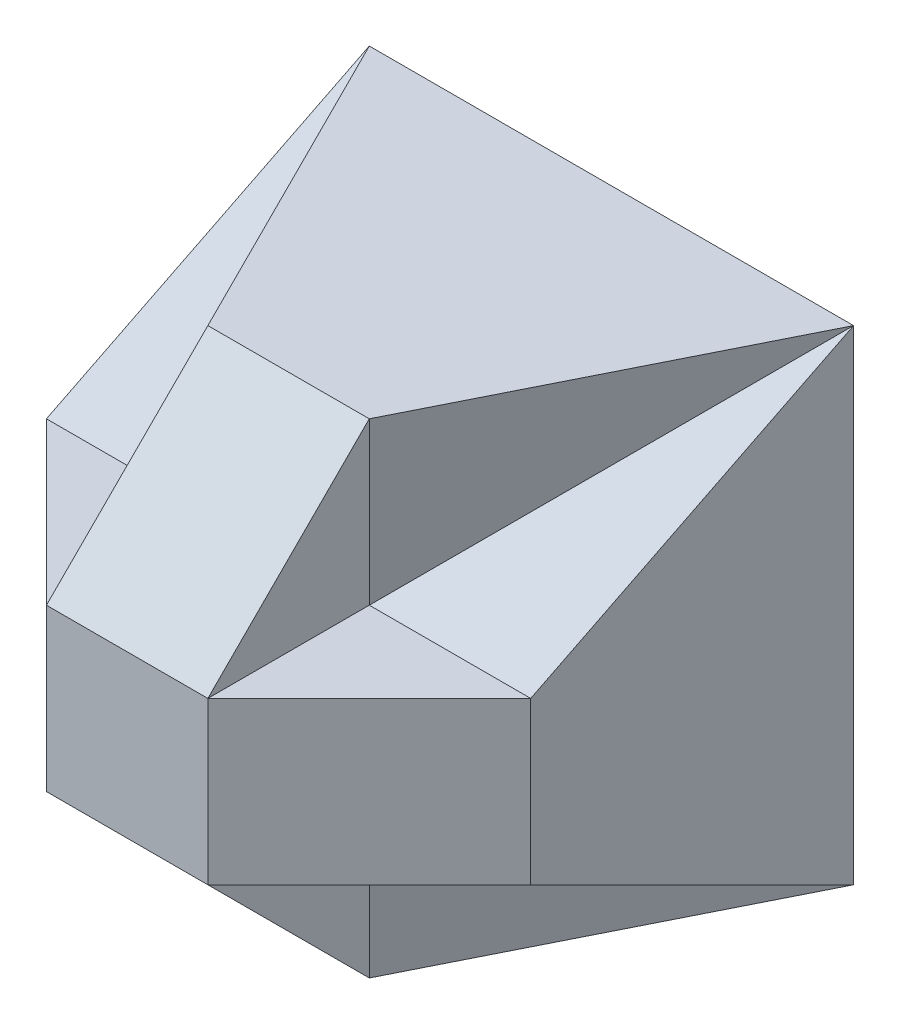
ISO-10303-21;
HEADER;
FILE_DESCRIPTION(('STEP AP214'),'2;1');
FILE_NAME('part.step','',(''),(''),'','','');
FILE_SCHEMA(('AUTOMOTIVE_DESIGN { 1 0 10303 214 1 1 1 1 }'));
ENDSEC;
DATA;
#1=APPLICATION_CONTEXT('core data for automotive mechanical design processes');
#2=APPLICATION_PROTOCOL_DEFINITION('international standard','automotive_design',2000,#1);
#3=PRODUCT_CONTEXT('',#1,'mechanical');
#4=PRODUCT('Part','Part','',(#3));
#5=PRODUCT_RELATED_PRODUCT_CATEGORY('part','',(#4));
#6=PRODUCT_DEFINITION_FORMATION('','',#4);
#7=PRODUCT_DEFINITION_CONTEXT('part definition',#1,'design');
#8=PRODUCT_DEFINITION('design','',#6,#7);
#9=PRODUCT_DEFINITION_SHAPE('','',#8);
#10=(LENGTH_UNIT() NAMED_UNIT(*) SI_UNIT(.MILLI.,.METRE.));
#11=(NAMED_UNIT(*) PLANE_ANGLE_UNIT() SI_UNIT($,.RADIAN.));
#12=(NAMED_UNIT(*) SI_UNIT($,.STERADIAN.) SOLID_ANGLE_UNIT());
#13=UNCERTAINTY_MEASURE_WITH_UNIT(LENGTH_MEASURE(1.E-05),#10,'distance_accuracy_value','');
#14=(GEOMETRIC_REPRESENTATION_CONTEXT(3) GLOBAL_UNCERTAINTY_ASSIGNED_CONTEXT((#13)) GLOBAL_UNIT_ASSIGNED_CONTEXT((#10,
#11,#12)) REPRESENTATION_CONTEXT('',''));
#15=CARTESIAN_POINT('',(0.,0.,0.));
#16=DIRECTION('',(0.,0.,1.));
#17=DIRECTION('',(1.,0.,0.));
#18=AXIS2_PLACEMENT_3D('',#15,#16,#17);
#19=CARTESIAN_POINT('',(-1.5,1.5,6.));
#20=DIRECTION('',(0.,-1.,0.));
#21=DIRECTION('',(0.,0.,-1.));
#22=AXIS2_PLACEMENT_3D('',#19,#20,#21);
#23=PLANE('',#22);
#24=DIRECTION('',(0.,0.,-1.));
#25=VECTOR('',#24,1.);
#26=CARTESIAN_POINT('',(-1.49999999999998,1.50000000000002,3.));
#27=LINE('',#26,#25);
#28=CARTESIAN_POINT('',(-1.49999999999998,1.50000000000002,6.));
#29=VERTEX_POINT('',#28);
#30=CARTESIAN_POINT('',(-1.49999999999998,1.50000000000002,3.));
#31=VERTEX_POINT('',#30);
#32=EDGE_CURVE('E491',#29,#31,#27,.T.);
#33=ORIENTED_EDGE('',*,*,#32,.T.);
#34=DIRECTION('',(1.,0.,0.));
#35=VECTOR('',#34,1.);
#36=CARTESIAN_POINT('',(-1.5,1.5,3.));
#37=LINE('',#36,#35);
#38=CARTESIAN_POINT('',(-4.5,1.5,3.));
#39=VERTEX_POINT('',#38);
#40=EDGE_CURVE('E444',#39,#31,#37,.T.);
#41=ORIENTED_EDGE('',*,*,#40,.F.);
#42=DIRECTION('',(0.707106781186547,0.,0.707106781186548));
#43=VECTOR('',#42,1.);
#44=CARTESIAN_POINT('',(-1.5,1.5,6.));
#45=LINE('',#44,#43);
#46=EDGE_CURVE('E517',#39,#29,#45,.T.);
#47=ORIENTED_EDGE('',*,*,#46,.T.);
#48=EDGE_LOOP('',(#33,#41,#47));
#49=FACE_BOUND('',#48,.T.);
#50=ADVANCED_FACE('F79',(#49),#23,.F.);
#51=CARTESIAN_POINT('',(-1.5,1.5,6.));
#52=DIRECTION('',(1.,0.,0.));
#53=DIRECTION('',(0.,1.,0.));
#54=AXIS2_PLACEMENT_3D('',#51,#52,#53);
#55=PLANE('',#54);
#56=DIRECTION('',(0.,0.,-1.));
#57=VECTOR('',#56,1.);
#58=CARTESIAN_POINT('',(-1.5,-1.5,3.));
#59=LINE('',#58,#57);
#60=CARTESIAN_POINT('',(-1.5,-1.5,6.));
#61=VERTEX_POINT('',#60);
#62=CARTESIAN_POINT('',(-1.5,-1.5,3.));
#63=VERTEX_POINT('',#62);
#64=EDGE_CURVE('E185',#61,#63,#59,.T.);
#65=ORIENTED_EDGE('',*,*,#64,.T.);
#66=CARTESIAN_POINT('',(-1.5,-1.5,3.));
#67=DIRECTION('',(0.,-1.,0.));
#68=VECTOR('',#67,1.);
#69=LINE('',#66,#68);
#70=CARTESIAN_POINT('',(-1.50000000000002,-4.49999999999999,3.));
#71=VERTEX_POINT('',#70);
#72=EDGE_CURVE('E209',#63,#71,#69,.T.);
#73=ORIENTED_EDGE('',*,*,#72,.T.);
#74=DIRECTION('',(0.,0.707106781186547,0.707106781186548));
#75=VECTOR('',#74,1.);
#76=CARTESIAN_POINT('',(-1.50000000000001,-1.5,6.));
#77=LINE('',#76,#75);
#78=EDGE_CURVE('E519',#71,#61,#77,.T.);
#79=ORIENTED_EDGE('',*,*,#78,.T.);
#80=EDGE_LOOP('',(#65,#73,#79));
#81=FACE_BOUND('',#80,.T.);
#82=ADVANCED_FACE('F244',(#81),#55,.F.);
#83=CARTESIAN_POINT('',(-1.5,-1.5,6.));
#84=DIRECTION('',(0.,1.,0.));
#85=DIRECTION('',(0.,0.,1.));
#86=AXIS2_PLACEMENT_3D('',#83,#84,#85);
#87=PLANE('',#86);
#88=DIRECTION('',(0.,0.,-1.));
#89=VECTOR('',#88,1.);
#90=CARTESIAN_POINT('',(1.49999999999999,-1.50000000000001,3.));
#91=LINE('',#90,#89);
#92=CARTESIAN_POINT('',(1.5,-1.5,6.));
#93=VERTEX_POINT('',#92);
#94=CARTESIAN_POINT('',(1.5,-1.5,3.));
#95=VERTEX_POINT('',#94);
#96=EDGE_CURVE('E524',#93,#95,#91,.T.);
#97=ORIENTED_EDGE('',*,*,#96,.T.);
#98=DIRECTION('',(-1.,0.,0.));
#99=VECTOR('',#98,1.);
#100=CARTESIAN_POINT('',(1.5,-1.5,3.));
#101=LINE('',#100,#99);
#102=CARTESIAN_POINT('',(4.5,-1.5,3.));
#103=VERTEX_POINT('',#102);
#104=EDGE_CURVE('E228',#103,#95,#101,.T.);
#105=ORIENTED_EDGE('',*,*,#104,.F.);
#106=DIRECTION('',(-0.707106781186547,0.,0.707106781186548));
#107=VECTOR('',#106,1.);
#108=CARTESIAN_POINT('',(1.5,-1.5,6.));
#109=LINE('',#108,#107);
#110=EDGE_CURVE('E210',#103,#93,#109,.T.);
#111=ORIENTED_EDGE('',*,*,#110,.T.);
#112=EDGE_LOOP('',(#97,#105,#111));
#113=FACE_BOUND('',#112,.T.);
#114=ADVANCED_FACE('F233',(#113),#87,.F.);
#115=CARTESIAN_POINT('',(-4.5,4.5,3.));
#116=DIRECTION('',(1.,0.,0.));
#117=DIRECTION('',(0.,1.,0.));
#118=AXIS2_PLACEMENT_3D('',#115,#116,#117);
#119=PLANE('',#118);
#120=DIRECTION('',(0.,0.447213595499958,0.894427190999916));
#121=VECTOR('',#120,1.);
#122=CARTESIAN_POINT('',(-4.5,-4.5,-3.));
#123=LINE('',#122,#121);
#124=CARTESIAN_POINT('',(-4.5,-4.5,-3.));
#125=VERTEX_POINT('',#124);
#126=CARTESIAN_POINT('',(-4.5,-1.5,3.));
#127=VERTEX_POINT('',#126);
#128=EDGE_CURVE('E586',#125,#127,#123,.T.);
#129=ORIENTED_EDGE('',*,*,#128,.T.);
#130=DIRECTION('',(0.,-1.,0.));
#131=VECTOR('',#130,1.);
#132=CARTESIAN_POINT('',(-4.5,4.5,3.));
#133=LINE('',#132,#131);
#134=EDGE_CURVE('E89',#39,#127,#133,.T.);
#135=ORIENTED_EDGE('',*,*,#134,.F.);
#136=DIRECTION('',(0.,-0.447213595499958,0.894427190999916));
#137=VECTOR('',#136,1.);
#138=CARTESIAN_POINT('',(-4.5,4.5,-3.));
#139=LINE('',#138,#137);
#140=CARTESIAN_POINT('',(-4.5,4.5,-3.));
#141=VERTEX_POINT('',#140);
#142=EDGE_CURVE('E448',#141,#39,#139,.T.);
#143=ORIENTED_EDGE('',*,*,#142,.F.);
#144=DIRECTION('',(0.,-1.,0.));
#145=VECTOR('',#144,1.);
#146=CARTESIAN_POINT('',(-4.5,4.5,-3.));
#147=LINE('',#146,#145);
#148=EDGE_CURVE('E348',#141,#125,#147,.T.);
#149=ORIENTED_EDGE('',*,*,#148,.T.);
#150=EDGE_LOOP('',(#129,#135,#143,#149));
#151=FACE_BOUND('',#150,.T.);
#152=ADVANCED_FACE('F243',(#151),#119,.F.);
#153=CARTESIAN_POINT('',(-4.5,-4.5,3.));
#154=DIRECTION('',(0.,1.,0.));
#155=DIRECTION('',(0.,0.,1.));
#156=AXIS2_PLACEMENT_3D('',#153,#154,#155);
#157=PLANE('',#156);
#158=DIRECTION('',(0.447213595499958,0.,0.894427190999916));
#159=VECTOR('',#158,1.);
#160=CARTESIAN_POINT('',(-4.5,-4.5,-3.));
#161=LINE('',#160,#159);
#162=EDGE_CURVE('E364',#125,#71,#161,.T.);
#163=ORIENTED_EDGE('',*,*,#162,.F.);
#164=DIRECTION('',(1.,0.,0.));
#165=VECTOR('',#164,1.);
#166=CARTESIAN_POINT('',(-4.5,-4.5,-3.));
#167=LINE('',#166,#165);
#168=CARTESIAN_POINT('',(4.5,-4.5,-3.));
#169=VERTEX_POINT('',#168);
#170=EDGE_CURVE('E334',#125,#169,#167,.T.);
#171=ORIENTED_EDGE('',*,*,#170,.T.);
#172=DIRECTION('',(-0.447213595499958,0.,0.894427190999916));
#173=VECTOR('',#172,1.);
#174=CARTESIAN_POINT('',(4.5,-4.5,-3.));
#175=LINE('',#174,#173);
#176=CARTESIAN_POINT('',(1.5,-4.5,3.));
#177=VERTEX_POINT('',#176);
#178=EDGE_CURVE('E363',#169,#177,#175,.T.);
#179=ORIENTED_EDGE('',*,*,#178,.T.);
#180=DIRECTION('',(1.,0.,0.));
#181=VECTOR('',#180,1.);
#182=CARTESIAN_POINT('',(-4.5,-4.5,3.));
#183=LINE('',#182,#181);
#184=EDGE_CURVE('E12',#71,#177,#183,.T.);
#185=ORIENTED_EDGE('',*,*,#184,.F.);
#186=EDGE_LOOP('',(#163,#171,#179,#185));
#187=FACE_BOUND('',#186,.T.);
#188=ADVANCED_FACE('F362',(#187),#157,.F.);
#189=CARTESIAN_POINT('',(-4.5,4.5,3.));
#190=DIRECTION('',(0.,-1.,0.));
#191=DIRECTION('',(0.,0.,-1.));
#192=AXIS2_PLACEMENT_3D('',#189,#190,#191);
#193=PLANE('',#192);
#194=DIRECTION('',(0.447213595499958,0.,0.894427190999916));
#195=VECTOR('',#194,1.);
#196=CARTESIAN_POINT('',(-4.5,4.5,-3.));
#197=LINE('',#196,#195);
#198=CARTESIAN_POINT('',(-1.5,4.5,3.));
#199=VERTEX_POINT('',#198);
#200=EDGE_CURVE('E437',#141,#199,#197,.T.);
#201=ORIENTED_EDGE('',*,*,#200,.T.);
#202=DIRECTION('',(-1.,0.,0.));
#203=VECTOR('',#202,1.);
#204=CARTESIAN_POINT('',(-4.5,4.5,3.));
#205=LINE('',#204,#203);
#206=CARTESIAN_POINT('',(1.50000000000005,4.49999999999998,3.));
#207=VERTEX_POINT('',#206);
#208=EDGE_CURVE('E333',#207,#199,#205,.T.);
#209=ORIENTED_EDGE('',*,*,#208,.F.);
#210=DIRECTION('',(-0.447213595499958,0.,0.894427190999916));
#211=VECTOR('',#210,1.);
#212=CARTESIAN_POINT('',(4.5,4.5,-3.));
#213=LINE('',#212,#211);
#214=CARTESIAN_POINT('',(4.5,4.5,-3.));
#215=VERTEX_POINT('',#214);
#216=EDGE_CURVE('E546',#215,#207,#213,.T.);
#217=ORIENTED_EDGE('',*,*,#216,.F.);
#218=DIRECTION('',(-1.,0.,0.));
#219=VECTOR('',#218,1.);
#220=CARTESIAN_POINT('',(-4.5,4.5,-3.));
#221=LINE('',#220,#219);
#222=EDGE_CURVE('E345',#215,#141,#221,.T.);
#223=ORIENTED_EDGE('',*,*,#222,.T.);
#224=EDGE_LOOP('',(#201,#209,#217,#223));
#225=FACE_BOUND('',#224,.T.);
#226=ADVANCED_FACE('F425',(#225),#193,.F.);
#227=CARTESIAN_POINT('',(4.5,4.5,3.));
#228=DIRECTION('',(-1.,0.,0.));
#229=DIRECTION('',(0.,-1.,0.));
#230=AXIS2_PLACEMENT_3D('',#227,#228,#229);
#231=PLANE('',#230);
#232=DIRECTION('',(0.,-0.447213595499958,0.894427190999916));
#233=VECTOR('',#232,1.);
#234=CARTESIAN_POINT('',(4.5,4.5,-3.));
#235=LINE('',#234,#233);
#236=CARTESIAN_POINT('',(4.5,1.5,3.));
#237=VERTEX_POINT('',#236);
#238=EDGE_CURVE('E314',#215,#237,#235,.T.);
#239=ORIENTED_EDGE('',*,*,#238,.T.);
#240=DIRECTION('',(0.,1.,0.));
#241=VECTOR('',#240,1.);
#242=CARTESIAN_POINT('',(4.5,4.5,3.));
#243=LINE('',#242,#241);
#244=EDGE_CURVE('E207',#103,#237,#243,.T.);
#245=ORIENTED_EDGE('',*,*,#244,.F.);
#246=DIRECTION('',(0.,0.447213595499958,0.894427190999916));
#247=VECTOR('',#246,1.);
#248=CARTESIAN_POINT('',(4.5,-4.5,-3.));
#249=LINE('',#248,#247);
#250=EDGE_CURVE('E97',#169,#103,#249,.T.);
#251=ORIENTED_EDGE('',*,*,#250,.F.);
#252=DIRECTION('',(0.,1.,0.));
#253=VECTOR('',#252,1.);
#254=CARTESIAN_POINT('',(4.5,4.5,-3.));
#255=LINE('',#254,#253);
#256=EDGE_CURVE('E324',#169,#215,#255,.T.);
#257=ORIENTED_EDGE('',*,*,#256,.T.);
#258=EDGE_LOOP('',(#239,#245,#251,#257));
#259=FACE_BOUND('',#258,.T.);
#260=ADVANCED_FACE('F81',(#259),#231,.F.);
#261=CARTESIAN_POINT('',(0.,0.,-3.));
#262=DIRECTION('',(0.,0.,1.));
#263=DIRECTION('',(1.,0.,0.));
#264=AXIS2_PLACEMENT_3D('',#261,#262,#263);
#265=PLANE('',#264);
#266=ORIENTED_EDGE('',*,*,#256,.F.);
#267=ORIENTED_EDGE('',*,*,#170,.F.);
#268=ORIENTED_EDGE('',*,*,#148,.F.);
#269=ORIENTED_EDGE('',*,*,#222,.F.);
#270=EDGE_LOOP('',(#266,#267,#268,#269));
#271=FACE_BOUND('',#270,.T.);
#272=ADVANCED_FACE('F367',(#271),#265,.F.);
#273=CARTESIAN_POINT('',(1.5,1.5,3.));
#274=DIRECTION('',(1.,0.,0.));
#275=VECTOR('',#274,1.);
#276=LINE('',#273,#275);
#277=CARTESIAN_POINT('',(1.50000000000002,1.49999999999998,3.));
#278=VERTEX_POINT('',#277);
#279=EDGE_CURVE('E192',#278,#237,#276,.T.);
#280=ORIENTED_EDGE('',*,*,#279,.F.);
#281=DIRECTION('',(0.,0.,-1.));
#282=VECTOR('',#281,1.);
#283=CARTESIAN_POINT('',(1.50000000000002,1.49999999999998,3.));
#284=LINE('',#283,#282);
#285=CARTESIAN_POINT('',(1.50000000000002,1.49999999999998,6.));
#286=VERTEX_POINT('',#285);
#287=EDGE_CURVE('E180',#286,#278,#284,.T.);
#288=ORIENTED_EDGE('',*,*,#287,.F.);
#289=DIRECTION('',(-0.707106781186547,0.,0.707106781186548));
#290=VECTOR('',#289,1.);
#291=CARTESIAN_POINT('',(1.5,1.5,6.));
#292=LINE('',#291,#290);
#293=EDGE_CURVE('E191',#237,#286,#292,.T.);
#294=ORIENTED_EDGE('',*,*,#293,.F.);
#295=EDGE_LOOP('',(#280,#288,#294));
#296=FACE_BOUND('',#295,.T.);
#297=ADVANCED_FACE('F189',(#296),#23,.F.);
#298=CARTESIAN_POINT('',(0.,0.,6.));
#299=DIRECTION('',(0.,0.,1.));
#300=DIRECTION('',(1.,0.,0.));
#301=AXIS2_PLACEMENT_3D('',#298,#299,#300);
#302=PLANE('',#301);
#303=DIRECTION('',(0.,1.,0.));
#304=VECTOR('',#303,1.);
#305=CARTESIAN_POINT('',(1.5,1.5,6.));
#306=LINE('',#305,#304);
#307=EDGE_CURVE('E175',#93,#286,#306,.T.);
#308=ORIENTED_EDGE('',*,*,#307,.T.);
#309=DIRECTION('',(-1.,0.,0.));
#310=VECTOR('',#309,1.);
#311=CARTESIAN_POINT('',(-1.5,1.5,6.));
#312=LINE('',#311,#310);
#313=EDGE_CURVE('E163',#286,#29,#312,.T.);
#314=ORIENTED_EDGE('',*,*,#313,.T.);
#315=DIRECTION('',(0.,-1.,0.));
#316=VECTOR('',#315,1.);
#317=CARTESIAN_POINT('',(-1.5,1.5,6.));
#318=LINE('',#317,#316);
#319=EDGE_CURVE('E174',#29,#61,#318,.T.);
#320=ORIENTED_EDGE('',*,*,#319,.T.);
#321=DIRECTION('',(1.,0.,0.));
#322=VECTOR('',#321,1.);
#323=CARTESIAN_POINT('',(-1.5,-1.5,6.));
#324=LINE('',#323,#322);
#325=EDGE_CURVE('E199',#61,#93,#324,.T.);
#326=ORIENTED_EDGE('',*,*,#325,.T.);
#327=EDGE_LOOP('',(#308,#314,#320,#326));
#328=FACE_BOUND('',#327,.T.);
#329=ADVANCED_FACE('F197',(#328),#302,.T.);
#330=CARTESIAN_POINT('',(2.4,0.,1.2));
#331=DIRECTION('',(0.894427190999916,0.,0.447213595499958));
#332=DIRECTION('',(0.447213595499958,0.,-0.894427190999916));
#333=AXIS2_PLACEMENT_3D('',#330,#331,#332);
#334=PLANE('',#333);
#335=ORIENTED_EDGE('',*,*,#178,.F.);
#336=DIRECTION('',(-0.408248290463863,0.408248290463863,0.816496580927726));
#337=VECTOR('',#336,1.);
#338=CARTESIAN_POINT('',(4.5,-4.5,-3.));
#339=LINE('',#338,#337);
#340=EDGE_CURVE('E372',#169,#95,#339,.T.);
#341=ORIENTED_EDGE('',*,*,#340,.T.);
#342=DIRECTION('',(0.,-1.,0.));
#343=VECTOR('',#342,1.);
#344=CARTESIAN_POINT('',(1.5,-1.5,3.));
#345=LINE('',#344,#343);
#346=EDGE_CURVE('E305',#95,#177,#345,.T.);
#347=ORIENTED_EDGE('',*,*,#346,.T.);
#348=EDGE_LOOP('',(#335,#341,#347));
#349=FACE_BOUND('',#348,.T.);
#350=ADVANCED_FACE('F392',(#349),#334,.T.);
#351=CARTESIAN_POINT('',(0.,-2.4,1.2));
#352=DIRECTION('',(0.,-0.894427190999916,0.447213595499958));
#353=DIRECTION('',(0.,-0.447213595499958,-0.894427190999916));
#354=AXIS2_PLACEMENT_3D('',#351,#352,#353);
#355=PLANE('',#354);
#356=ORIENTED_EDGE('',*,*,#340,.F.);
#357=ORIENTED_EDGE('',*,*,#250,.T.);
#358=ORIENTED_EDGE('',*,*,#104,.T.);
#359=EDGE_LOOP('',(#356,#357,#358));
#360=FACE_BOUND('',#359,.T.);
#361=ADVANCED_FACE('F401',(#360),#355,.T.);
#362=CARTESIAN_POINT('',(2.4,0.,1.2));
#363=DIRECTION('',(0.894427190999916,0.,0.447213595499958));
#364=DIRECTION('',(0.447213595499958,0.,-0.894427190999916));
#365=AXIS2_PLACEMENT_3D('',#362,#363,#364);
#366=PLANE('',#365);
#367=ORIENTED_EDGE('',*,*,#216,.T.);
#368=CARTESIAN_POINT('',(1.50000000000002,1.49999999999998,3.));
#369=DIRECTION('',(0.,1.,0.));
#370=VECTOR('',#369,1.);
#371=LINE('',#368,#370);
#372=EDGE_CURVE('E182',#278,#207,#371,.T.);
#373=ORIENTED_EDGE('',*,*,#372,.F.);
#374=DIRECTION('',(-0.408248290463863,-0.408248290463863,0.816496580927726));
#375=VECTOR('',#374,1.);
#376=CARTESIAN_POINT('',(4.5,4.5,-3.));
#377=LINE('',#376,#375);
#378=EDGE_CURVE('E549',#215,#278,#377,.T.);
#379=ORIENTED_EDGE('',*,*,#378,.F.);
#380=EDGE_LOOP('',(#367,#373,#379));
#381=FACE_BOUND('',#380,.T.);
#382=ADVANCED_FACE('F407',(#381),#366,.T.);
#383=CARTESIAN_POINT('',(0.,2.4,1.2));
#384=DIRECTION('',(0.,0.894427190999916,0.447213595499958));
#385=DIRECTION('',(0.,0.447213595499958,-0.894427190999916));
#386=AXIS2_PLACEMENT_3D('',#383,#384,#385);
#387=PLANE('',#386);
#388=ORIENTED_EDGE('',*,*,#378,.T.);
#389=ORIENTED_EDGE('',*,*,#279,.T.);
#390=ORIENTED_EDGE('',*,*,#238,.F.);
#391=EDGE_LOOP('',(#388,#389,#390));
#392=FACE_BOUND('',#391,.T.);
#393=ADVANCED_FACE('F402',(#392),#387,.T.);
#394=CARTESIAN_POINT('',(-2.4,0.,1.2));
#395=DIRECTION('',(-0.894427190999916,0.,0.447213595499958));
#396=DIRECTION('',(-0.447213595499958,0.,-0.894427190999916));
#397=AXIS2_PLACEMENT_3D('',#394,#395,#396);
#398=PLANE('',#397);
#399=ORIENTED_EDGE('',*,*,#200,.F.);
#400=DIRECTION('',(0.408248290463863,-0.408248290463863,0.816496580927726));
#401=VECTOR('',#400,1.);
#402=CARTESIAN_POINT('',(-4.5,4.5,-3.));
#403=LINE('',#402,#401);
#404=EDGE_CURVE('E443',#141,#31,#403,.T.);
#405=ORIENTED_EDGE('',*,*,#404,.T.);
#406=DIRECTION('',(0.,1.,0.));
#407=VECTOR('',#406,1.);
#408=CARTESIAN_POINT('',(-1.5,1.5,3.));
#409=LINE('',#408,#407);
#410=EDGE_CURVE('E451',#31,#199,#409,.T.);
#411=ORIENTED_EDGE('',*,*,#410,.T.);
#412=EDGE_LOOP('',(#399,#405,#411));
#413=FACE_BOUND('',#412,.T.);
#414=ADVANCED_FACE('F565',(#413),#398,.T.);
#415=CARTESIAN_POINT('',(0.,2.4,1.2));
#416=DIRECTION('',(0.,0.894427190999916,0.447213595499958));
#417=DIRECTION('',(0.,0.447213595499958,-0.894427190999916));
#418=AXIS2_PLACEMENT_3D('',#415,#416,#417);
#419=PLANE('',#418);
#420=ORIENTED_EDGE('',*,*,#404,.F.);
#421=ORIENTED_EDGE('',*,*,#142,.T.);
#422=ORIENTED_EDGE('',*,*,#40,.T.);
#423=EDGE_LOOP('',(#420,#421,#422));
#424=FACE_BOUND('',#423,.T.);
#425=ADVANCED_FACE('F561',(#424),#419,.T.);
#426=CARTESIAN_POINT('',(-2.4,0.,1.2));
#427=DIRECTION('',(-0.894427190999916,0.,0.447213595499958));
#428=DIRECTION('',(-0.447213595499958,0.,-0.894427190999916));
#429=AXIS2_PLACEMENT_3D('',#426,#427,#428);
#430=PLANE('',#429);
#431=ORIENTED_EDGE('',*,*,#162,.T.);
#432=ORIENTED_EDGE('',*,*,#72,.F.);
#433=DIRECTION('',(0.408248290463863,0.408248290463863,0.816496580927726));
#434=VECTOR('',#433,1.);
#435=CARTESIAN_POINT('',(-4.5,-4.5,-3.));
#436=LINE('',#435,#434);
#437=EDGE_CURVE('E105',#125,#63,#436,.T.);
#438=ORIENTED_EDGE('',*,*,#437,.F.);
#439=EDGE_LOOP('',(#431,#432,#438));
#440=FACE_BOUND('',#439,.T.);
#441=ADVANCED_FACE('F564',(#440),#430,.T.);
#442=CARTESIAN_POINT('',(0.,-2.4,1.2));
#443=DIRECTION('',(0.,-0.894427190999916,0.447213595499958));
#444=DIRECTION('',(0.,-0.447213595499958,-0.894427190999916));
#445=AXIS2_PLACEMENT_3D('',#442,#443,#444);
#446=PLANE('',#445);
#447=ORIENTED_EDGE('',*,*,#437,.T.);
#448=CARTESIAN_POINT('',(-1.5,-1.5,3.));
#449=DIRECTION('',(-1.,0.,0.));
#450=VECTOR('',#449,1.);
#451=LINE('',#448,#450);
#452=EDGE_CURVE('E215',#63,#127,#451,.T.);
#453=ORIENTED_EDGE('',*,*,#452,.T.);
#454=ORIENTED_EDGE('',*,*,#128,.F.);
#455=EDGE_LOOP('',(#447,#453,#454));
#456=FACE_BOUND('',#455,.T.);
#457=ADVANCED_FACE('F612',(#456),#446,.T.);
#458=CARTESIAN_POINT('',(1.5,1.5,6.));
#459=DIRECTION('',(0.707106781186548,0.,0.707106781186547));
#460=DIRECTION('',(0.707106781186547,0.,-0.707106781186548));
#461=AXIS2_PLACEMENT_3D('',#458,#459,#460);
#462=PLANE('',#461);
#463=ORIENTED_EDGE('',*,*,#110,.F.);
#464=ORIENTED_EDGE('',*,*,#244,.T.);
#465=ORIENTED_EDGE('',*,*,#293,.T.);
#466=ORIENTED_EDGE('',*,*,#307,.F.);
#467=EDGE_LOOP('',(#463,#464,#465,#466));
#468=FACE_BOUND('',#467,.T.);
#469=ADVANCED_FACE('F206',(#468),#462,.T.);
#470=CARTESIAN_POINT('',(1.49999999999999,-1.50000000000001,6.));
#471=DIRECTION('',(0.,-0.707106781186548,0.707106781186547));
#472=DIRECTION('',(0.,-0.707106781186547,-0.707106781186548));
#473=AXIS2_PLACEMENT_3D('',#470,#471,#472);
#474=PLANE('',#473);
#475=ORIENTED_EDGE('',*,*,#78,.F.);
#476=ORIENTED_EDGE('',*,*,#184,.T.);
#477=DIRECTION('',(0.,0.707106781186547,0.707106781186548));
#478=VECTOR('',#477,1.);
#479=CARTESIAN_POINT('',(1.49999999999999,-1.50000000000001,6.));
#480=LINE('',#479,#478);
#481=EDGE_CURVE('E216',#177,#93,#480,.T.);
#482=ORIENTED_EDGE('',*,*,#481,.T.);
#483=ORIENTED_EDGE('',*,*,#325,.F.);
#484=EDGE_LOOP('',(#475,#476,#482,#483));
#485=FACE_BOUND('',#484,.T.);
#486=ADVANCED_FACE('F295',(#485),#474,.T.);
#487=CARTESIAN_POINT('',(1.5,0.,0.));
#488=DIRECTION('',(-1.,0.,0.));
#489=DIRECTION('',(0.,0.,-1.));
#490=AXIS2_PLACEMENT_3D('',#487,#488,#489);
#491=PLANE('',#490);
#492=ORIENTED_EDGE('',*,*,#96,.F.);
#493=ORIENTED_EDGE('',*,*,#481,.F.);
#494=ORIENTED_EDGE('',*,*,#346,.F.);
#495=EDGE_LOOP('',(#492,#493,#494));
#496=FACE_BOUND('',#495,.T.);
#497=ADVANCED_FACE('F291',(#496),#491,.F.);
#498=CARTESIAN_POINT('',(-1.5,-1.5,6.));
#499=DIRECTION('',(-0.707106781186548,0.,0.707106781186547));
#500=DIRECTION('',(0.707106781186547,0.,0.707106781186548));
#501=AXIS2_PLACEMENT_3D('',#498,#499,#500);
#502=PLANE('',#501);
#503=ORIENTED_EDGE('',*,*,#46,.F.);
#504=ORIENTED_EDGE('',*,*,#134,.T.);
#505=DIRECTION('',(0.707106781186547,0.,0.707106781186548));
#506=VECTOR('',#505,1.);
#507=CARTESIAN_POINT('',(-1.5,-1.5,6.));
#508=LINE('',#507,#506);
#509=EDGE_CURVE('E266',#127,#61,#508,.T.);
#510=ORIENTED_EDGE('',*,*,#509,.T.);
#511=ORIENTED_EDGE('',*,*,#319,.F.);
#512=EDGE_LOOP('',(#503,#504,#510,#511));
#513=FACE_BOUND('',#512,.T.);
#514=ADVANCED_FACE('F289',(#513),#502,.T.);
#515=CARTESIAN_POINT('',(0.,-1.5,0.));
#516=DIRECTION('',(0.,1.,0.));
#517=DIRECTION('',(0.,0.,-1.));
#518=AXIS2_PLACEMENT_3D('',#515,#516,#517);
#519=PLANE('',#518);
#520=ORIENTED_EDGE('',*,*,#64,.F.);
#521=ORIENTED_EDGE('',*,*,#509,.F.);
#522=ORIENTED_EDGE('',*,*,#452,.F.);
#523=EDGE_LOOP('',(#520,#521,#522));
#524=FACE_BOUND('',#523,.T.);
#525=ADVANCED_FACE('F279',(#524),#519,.F.);
#526=CARTESIAN_POINT('',(-1.49999999999998,1.50000000000002,6.));
#527=DIRECTION('',(0.,0.707106781186548,0.707106781186547));
#528=DIRECTION('',(0.,-0.707106781186547,0.707106781186548));
#529=AXIS2_PLACEMENT_3D('',#526,#527,#528);
#530=PLANE('',#529);
#531=DIRECTION('',(0.,-0.707106781186547,0.707106781186548));
#532=VECTOR('',#531,1.);
#533=CARTESIAN_POINT('',(1.50000000000002,1.49999999999998,6.));
#534=LINE('',#533,#532);
#535=EDGE_CURVE('E167',#207,#286,#534,.T.);
#536=ORIENTED_EDGE('',*,*,#535,.F.);
#537=ORIENTED_EDGE('',*,*,#208,.T.);
#538=DIRECTION('',(0.,-0.707106781186547,0.707106781186548));
#539=VECTOR('',#538,1.);
#540=CARTESIAN_POINT('',(-1.49999999999998,1.50000000000002,6.));
#541=LINE('',#540,#539);
#542=EDGE_CURVE('E169',#199,#29,#541,.T.);
#543=ORIENTED_EDGE('',*,*,#542,.T.);
#544=ORIENTED_EDGE('',*,*,#313,.F.);
#545=EDGE_LOOP('',(#536,#537,#543,#544));
#546=FACE_BOUND('',#545,.T.);
#547=ADVANCED_FACE('F165',(#546),#530,.T.);
#548=CARTESIAN_POINT('',(-1.5,0.,0.));
#549=DIRECTION('',(1.,0.,0.));
#550=DIRECTION('',(0.,0.,-1.));
#551=AXIS2_PLACEMENT_3D('',#548,#549,#550);
#552=PLANE('',#551);
#553=ORIENTED_EDGE('',*,*,#32,.F.);
#554=ORIENTED_EDGE('',*,*,#542,.F.);
#555=ORIENTED_EDGE('',*,*,#410,.F.);
#556=EDGE_LOOP('',(#553,#554,#555));
#557=FACE_BOUND('',#556,.T.);
#558=ADVANCED_FACE('F481',(#557),#552,.F.);
#559=CARTESIAN_POINT('',(1.5,0.,0.));
#560=DIRECTION('',(1.,0.,0.));
#561=DIRECTION('',(0.,0.,-1.));
#562=AXIS2_PLACEMENT_3D('',#559,#560,#561);
#563=PLANE('',#562);
#564=ORIENTED_EDGE('',*,*,#287,.T.);
#565=ORIENTED_EDGE('',*,*,#372,.T.);
#566=ORIENTED_EDGE('',*,*,#535,.T.);
#567=EDGE_LOOP('',(#564,#565,#566));
#568=FACE_BOUND('',#567,.T.);
#569=ADVANCED_FACE('F179',(#568),#563,.T.);
#570=CLOSED_SHELL('',(#50,#82,#114,#152,#188,#226,#260,#272,#297,#329,#350,#361,#382,#393,#414,
#425,#441,#457,#469,#486,#497,#514,#525,#547,#558,#569));
#571=MANIFOLD_SOLID_BREP('B2',#570);
#572=ADVANCED_BREP_SHAPE_REPRESENTATION('',(#18,#571),#14);
#573=SHAPE_DEFINITION_REPRESENTATION(#9,#572);
ENDSEC;
END-ISO-10303-21;
